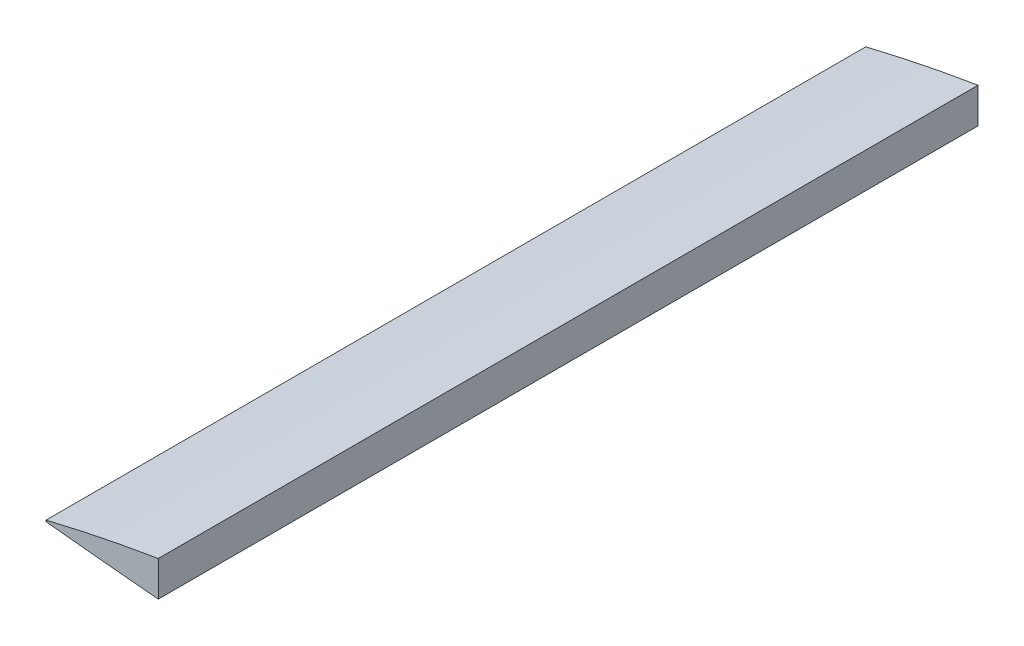
ISO-10303-21;
HEADER;
FILE_DESCRIPTION(('STEP AP214'),'2;1');
FILE_NAME('part.step','',(''),(''),'','','');
FILE_SCHEMA(('AUTOMOTIVE_DESIGN { 1 0 10303 214 1 1 1 1 }'));
ENDSEC;
DATA;
#1=APPLICATION_CONTEXT('core data for automotive mechanical design processes');
#2=APPLICATION_PROTOCOL_DEFINITION('international standard','automotive_design',2000,#1);
#3=PRODUCT_CONTEXT('',#1,'mechanical');
#4=PRODUCT('Part','Part','',(#3));
#5=PRODUCT_RELATED_PRODUCT_CATEGORY('part','',(#4));
#6=PRODUCT_DEFINITION_FORMATION('','',#4);
#7=PRODUCT_DEFINITION_CONTEXT('part definition',#1,'design');
#8=PRODUCT_DEFINITION('design','',#6,#7);
#9=PRODUCT_DEFINITION_SHAPE('','',#8);
#10=(LENGTH_UNIT() NAMED_UNIT(*) SI_UNIT(.MILLI.,.METRE.));
#11=(NAMED_UNIT(*) PLANE_ANGLE_UNIT() SI_UNIT($,.RADIAN.));
#12=(NAMED_UNIT(*) SI_UNIT($,.STERADIAN.) SOLID_ANGLE_UNIT());
#13=UNCERTAINTY_MEASURE_WITH_UNIT(LENGTH_MEASURE(1.E-05),#10,'distance_accuracy_value','');
#14=(GEOMETRIC_REPRESENTATION_CONTEXT(3) GLOBAL_UNCERTAINTY_ASSIGNED_CONTEXT((#13)) GLOBAL_UNIT_ASSIGNED_CONTEXT((#10,
#11,#12)) REPRESENTATION_CONTEXT('',''));
#15=CARTESIAN_POINT('',(0.,0.,0.));
#16=DIRECTION('',(0.,0.,1.));
#17=DIRECTION('',(1.,0.,0.));
#18=AXIS2_PLACEMENT_3D('',#15,#16,#17);
#19=CARTESIAN_POINT('',(-238.52642,17.5878370076643,-612.));
#20=CARTESIAN_POINT('',(-240.974092949972,17.1818838754023,-612.));
#21=CARTESIAN_POINT('',(-246.929768523728,16.1941190868382,-612.));
#22=CARTESIAN_POINT('',(-256.181161895511,14.5460715684089,-612.));
#23=CARTESIAN_POINT('',(-266.070660074322,12.7092596735176,-612.));
#24=CARTESIAN_POINT('',(-275.306483122763,10.9116484889903,-612.));
#25=CARTESIAN_POINT('',(-283.834265101251,9.183942036888,-612.));
#26=CARTESIAN_POINT('',(-291.603292922688,7.5511249847941,-612.));
#27=CARTESIAN_POINT('',(-298.567864300226,6.03877561329265,-612.));
#28=CARTESIAN_POINT('',(-304.687234381282,4.67105765373805,-612.));
#29=CARTESIAN_POINT('',(-309.925850126722,3.47060146510907,-612.));
#30=CARTESIAN_POINT('',(-314.253461717538,2.45784481186031,-612.));
#31=CARTESIAN_POINT('',(-317.645235976134,1.65054432161122,-612.));
#32=CARTESIAN_POINT('',(-320.081782459232,1.06307048748221,-612.));
#33=CARTESIAN_POINT('',(-321.538022535749,0.70902490136111,-612.));
#34=CARTESIAN_POINT('',(-322.180548985879,0.552044035812624,-612.));
#35=CARTESIAN_POINT('',(-322.333,0.514797487992484,-612.));
#36=B_SPLINE_CURVE_WITH_KNOTS('',3,(#19,#20,#21,#22,#23,#24,#25,#26,#27,#28,#29,#30,#31,#32,#33,
#34,#35),.UNSPECIFIED.,.F.,.F.,(4,1,1,1,1,1,1,1,1,1,1,1,1,1,4),(0.,0.0870070051452904,
0.21170536500617,0.329527112719374,0.439740644540536,0.541660709078569,0.634652346186561,
0.718134668905484,0.791584505134145,0.854539888493236,0.906603358473801,0.947445002011979,
0.976805146454737,0.994496601743555,1.),.UNSPECIFIED.);
#37=DIRECTION('',(0.,0.,1.));
#38=VECTOR('',#37,1.);
#39=SURFACE_OF_LINEAR_EXTRUSION('',#36,#38);
#40=CARTESIAN_POINT('',(-238.52642,17.5878370076643,0.));
#41=CARTESIAN_POINT('',(-240.974092949972,17.1818838754023,0.));
#42=CARTESIAN_POINT('',(-246.929768523728,16.1941190868382,0.));
#43=CARTESIAN_POINT('',(-256.181161895511,14.5460715684089,0.));
#44=CARTESIAN_POINT('',(-266.070660074322,12.7092596735176,0.));
#45=CARTESIAN_POINT('',(-275.306483122763,10.9116484889903,0.));
#46=CARTESIAN_POINT('',(-283.834265101251,9.183942036888,0.));
#47=CARTESIAN_POINT('',(-291.603292922688,7.5511249847941,0.));
#48=CARTESIAN_POINT('',(-298.567864300226,6.03877561329265,0.));
#49=CARTESIAN_POINT('',(-304.687234381282,4.67105765373805,0.));
#50=CARTESIAN_POINT('',(-309.925850126722,3.47060146510907,0.));
#51=CARTESIAN_POINT('',(-314.253461717538,2.45784481186031,0.));
#52=CARTESIAN_POINT('',(-317.645235976134,1.65054432161122,0.));
#53=CARTESIAN_POINT('',(-320.081782459232,1.06307048748221,0.));
#54=CARTESIAN_POINT('',(-321.538022535749,0.70902490136111,0.));
#55=CARTESIAN_POINT('',(-322.180548985879,0.552044035812624,0.));
#56=CARTESIAN_POINT('',(-322.333,0.514797487992484,0.));
#57=B_SPLINE_CURVE_WITH_KNOTS('',3,(#40,#41,#42,#43,#44,#45,#46,#47,#48,#49,#50,#51,#52,#53,#54,
#55,#56),.UNSPECIFIED.,.F.,.F.,(4,1,1,1,1,1,1,1,1,1,1,1,1,1,4),(0.,0.0870070051452904,
0.21170536500617,0.329527112719374,0.439740644540536,0.541660709078569,0.634652346186561,
0.718134668905484,0.791584505134145,0.854539888493236,0.906603358473801,0.947445002011979,
0.976805146454737,0.994496601743555,1.),.UNSPECIFIED.);
#58=CARTESIAN_POINT('',(-238.52642,17.5878370076643,0.));
#59=VERTEX_POINT('',#58);
#60=CARTESIAN_POINT('',(-322.333,0.514797487992484,0.));
#61=VERTEX_POINT('',#60);
#62=EDGE_CURVE('E133',#59,#61,#57,.T.);
#63=ORIENTED_EDGE('',*,*,#62,.F.);
#64=DIRECTION('',(0.,0.,1.));
#65=VECTOR('',#64,1.);
#66=CARTESIAN_POINT('',(-238.52642,17.5878370076643,-612.));
#67=LINE('',#66,#65);
#68=CARTESIAN_POINT('',(-238.52642,17.5878370076643,-612.));
#69=VERTEX_POINT('',#68);
#70=EDGE_CURVE('E65',#69,#59,#67,.T.);
#71=ORIENTED_EDGE('',*,*,#70,.F.);
#72=CARTESIAN_POINT('',(-322.333,0.514797487992484,-612.));
#73=VERTEX_POINT('',#72);
#74=EDGE_CURVE('E146',#69,#73,#36,.T.);
#75=ORIENTED_EDGE('',*,*,#74,.T.);
#76=DIRECTION('',(0.,0.,1.));
#77=VECTOR('',#76,1.);
#78=CARTESIAN_POINT('',(-322.333,0.514797487992484,-612.));
#79=LINE('',#78,#77);
#80=EDGE_CURVE('E91',#73,#61,#79,.T.);
#81=ORIENTED_EDGE('',*,*,#80,.T.);
#82=EDGE_LOOP('',(#63,#71,#75,#81));
#83=FACE_BOUND('',#82,.T.);
#84=ADVANCED_FACE('F39',(#83),#39,.T.);
#85=CARTESIAN_POINT('',(-238.52642,17.5878370076643,-612.));
#86=DIRECTION('',(1.,0.,0.));
#87=DIRECTION('',(0.,0.,-1.));
#88=AXIS2_PLACEMENT_3D('',#85,#86,#87);
#89=PLANE('',#88);
#90=DIRECTION('',(0.,1.,0.));
#91=VECTOR('',#90,1.);
#92=CARTESIAN_POINT('',(-238.52642,17.5878370076643,0.));
#93=LINE('',#92,#91);
#94=CARTESIAN_POINT('',(-238.52642,-8.71669260823671,0.));
#95=VERTEX_POINT('',#94);
#96=EDGE_CURVE('E152',#95,#59,#93,.T.);
#97=ORIENTED_EDGE('',*,*,#96,.F.);
#98=DIRECTION('',(0.,0.,1.));
#99=VECTOR('',#98,1.);
#100=CARTESIAN_POINT('',(-238.52642,-8.71669260823671,-612.));
#101=LINE('',#100,#99);
#102=CARTESIAN_POINT('',(-238.52642,-8.71669260823671,-612.));
#103=VERTEX_POINT('',#102);
#104=EDGE_CURVE('E204',#103,#95,#101,.T.);
#105=ORIENTED_EDGE('',*,*,#104,.F.);
#106=DIRECTION('',(0.,1.,0.));
#107=VECTOR('',#106,1.);
#108=CARTESIAN_POINT('',(-238.52642,17.5878370076643,-612.));
#109=LINE('',#108,#107);
#110=EDGE_CURVE('E163',#103,#69,#109,.T.);
#111=ORIENTED_EDGE('',*,*,#110,.T.);
#112=ORIENTED_EDGE('',*,*,#70,.T.);
#113=EDGE_LOOP('',(#97,#105,#111,#112));
#114=FACE_BOUND('',#113,.T.);
#115=ADVANCED_FACE('F173',(#114),#89,.T.);
#116=CARTESIAN_POINT('',(-322.333,-0.506550056177637,-612.));
#117=CARTESIAN_POINT('',(-322.321741192867,-0.506509981551179,-612.));
#118=CARTESIAN_POINT('',(-322.141989510192,-0.505870172959284,-612.));
#119=CARTESIAN_POINT('',(-321.464120443008,-0.620061141040111,-612.));
#120=CARTESIAN_POINT('',(-319.961203892299,-0.741044399369998,-612.));
#121=CARTESIAN_POINT('',(-317.472079994317,-1.02767765853985,-612.));
#122=CARTESIAN_POINT('',(-314.008232693801,-1.38276070488723,-612.));
#123=CARTESIAN_POINT('',(-309.594932863968,-1.84681463713867,-612.));
#124=CARTESIAN_POINT('',(-304.260184655827,-2.39533472644298,-612.));
#125=CARTESIAN_POINT('',(-298.039247242634,-3.02859766428665,-612.));
#126=CARTESIAN_POINT('',(-290.972478701488,-3.73716679662763,-612.));
#127=CARTESIAN_POINT('',(-283.105667880865,-4.514534116657,-612.));
#128=CARTESIAN_POINT('',(-274.489440351608,-5.35291829584387,-612.));
#129=CARTESIAN_POINT('',(-265.178981161559,-6.24499515598002,-612.));
#130=CARTESIAN_POINT('',(-255.233473927844,-7.18185891999825,-612.));
#131=CARTESIAN_POINT('',(-246.278870053507,-8.01388768890295,-612.));
#132=CARTESIAN_POINT('',(-240.645712688873,-8.52456633628809,-612.));
#133=CARTESIAN_POINT('',(-238.52642,-8.71669260823671,-612.));
#134=B_SPLINE_CURVE_WITH_KNOTS('',3,(#116,#117,#118,#119,#120,#121,#122,#123,#124,#125,#126,
#127,#128,#129,#130,#131,#132,#133),.UNSPECIFIED.,.F.,.F.,(4,1,1,1,1,1,1,1,1,1,1,1,1,1,1,4),(0.,
0.000401027004237386,0.00640256804801387,0.024366740541906,0.0541726551316404,
0.0956203448841404,0.148432949269866,0.212259606924723,0.286678920603446,0.371202853061501,
0.465280924763119,0.568304609739685,0.67961185947699,0.798491720853711,0.924189047970984,1.),.UNSPECIFIED.);
#135=DIRECTION('',(0.,0.,1.));
#136=VECTOR('',#135,1.);
#137=SURFACE_OF_LINEAR_EXTRUSION('',#134,#136);
#138=CARTESIAN_POINT('',(-322.333,-0.506550056177637,-83.8999999999999));
#139=CARTESIAN_POINT('',(-322.321741192867,-0.506509981551179,-83.8999999999999));
#140=CARTESIAN_POINT('',(-322.141989510192,-0.505870172959284,-83.8999999999999));
#141=CARTESIAN_POINT('',(-321.464120443008,-0.620061141040111,-83.8999999999999));
#142=CARTESIAN_POINT('',(-319.961203892299,-0.741044399369998,-83.8999999999999));
#143=CARTESIAN_POINT('',(-317.472079994317,-1.02767765853985,-83.8999999999999));
#144=CARTESIAN_POINT('',(-314.008232693801,-1.38276070488723,-83.8999999999999));
#145=CARTESIAN_POINT('',(-309.594932863968,-1.84681463713867,-83.8999999999999));
#146=CARTESIAN_POINT('',(-304.260184655827,-2.39533472644298,-83.8999999999999));
#147=CARTESIAN_POINT('',(-298.039247242634,-3.02859766428665,-83.8999999999999));
#148=CARTESIAN_POINT('',(-290.972478701488,-3.73716679662763,-83.8999999999999));
#149=CARTESIAN_POINT('',(-283.105667880865,-4.514534116657,-83.8999999999999));
#150=CARTESIAN_POINT('',(-274.489440351608,-5.35291829584387,-83.8999999999999));
#151=CARTESIAN_POINT('',(-265.178981161559,-6.24499515598002,-83.8999999999999));
#152=CARTESIAN_POINT('',(-255.233473927844,-7.18185891999825,-83.8999999999999));
#153=CARTESIAN_POINT('',(-246.278870053507,-8.01388768890295,-83.8999999999999));
#154=CARTESIAN_POINT('',(-240.645712688873,-8.52456633628809,-83.8999999999999));
#155=CARTESIAN_POINT('',(-238.52642,-8.71669260823671,-83.8999999999999));
#156=B_SPLINE_CURVE_WITH_KNOTS('',3,(#138,#139,#140,#141,#142,#143,#144,#145,#146,#147,#148,
#149,#150,#151,#152,#153,#154,#155),.UNSPECIFIED.,.F.,.F.,(4,1,1,1,1,1,1,1,1,1,1,1,1,1,1,4),(0.,
0.000401027004237386,0.00640256804801387,0.024366740541906,0.0541726551316404,
0.0956203448841404,0.148432949269866,0.212259606924723,0.286678920603446,0.371202853061501,
0.465280924763119,0.568304609739685,0.67961185947699,0.798491720853711,0.924189047970984,1.),.UNSPECIFIED.);
#157=CARTESIAN_POINT('',(-241.25,-8.46964250475909,-83.8999999999999));
#158=VERTEX_POINT('',#157);
#159=CARTESIAN_POINT('',(-262.25,-6.51994947132136,-83.8999999999999));
#160=VERTEX_POINT('',#159);
#161=EDGE_CURVE('E11',#158,#160,#156,.F.);
#162=ORIENTED_EDGE('',*,*,#161,.F.);
#163=DIRECTION('',(0.,0.,1.));
#164=VECTOR('',#163,1.);
#165=CARTESIAN_POINT('',(-241.25,-8.46964250475909,-612.));
#166=LINE('',#165,#164);
#167=CARTESIAN_POINT('',(-241.25,-8.46964250475909,-96.8999999999999));
#168=VERTEX_POINT('',#167);
#169=EDGE_CURVE('E121',#158,#168,#166,.F.);
#170=ORIENTED_EDGE('',*,*,#169,.T.);
#171=CARTESIAN_POINT('',(-322.333,-0.506550056177637,-96.9));
#172=CARTESIAN_POINT('',(-322.321741192867,-0.506509981551179,-96.9));
#173=CARTESIAN_POINT('',(-322.141989510192,-0.505870172959284,-96.9));
#174=CARTESIAN_POINT('',(-321.464120443008,-0.620061141040111,-96.9));
#175=CARTESIAN_POINT('',(-319.961203892299,-0.741044399369998,-96.9));
#176=CARTESIAN_POINT('',(-317.472079994317,-1.02767765853985,-96.9));
#177=CARTESIAN_POINT('',(-314.008232693801,-1.38276070488723,-96.9));
#178=CARTESIAN_POINT('',(-309.594932863968,-1.84681463713867,-96.9));
#179=CARTESIAN_POINT('',(-304.260184655827,-2.39533472644298,-96.9));
#180=CARTESIAN_POINT('',(-298.039247242634,-3.02859766428665,-96.9));
#181=CARTESIAN_POINT('',(-290.972478701488,-3.73716679662763,-96.9));
#182=CARTESIAN_POINT('',(-283.105667880865,-4.514534116657,-96.9));
#183=CARTESIAN_POINT('',(-274.489440351608,-5.35291829584387,-96.9));
#184=CARTESIAN_POINT('',(-265.178981161559,-6.24499515598002,-96.9));
#185=CARTESIAN_POINT('',(-255.233473927844,-7.18185891999825,-96.9));
#186=CARTESIAN_POINT('',(-246.278870053507,-8.01388768890295,-96.9));
#187=CARTESIAN_POINT('',(-240.645712688873,-8.52456633628809,-96.9));
#188=CARTESIAN_POINT('',(-238.52642,-8.71669260823671,-96.9));
#189=B_SPLINE_CURVE_WITH_KNOTS('',3,(#171,#172,#173,#174,#175,#176,#177,#178,#179,#180,#181,
#182,#183,#184,#185,#186,#187,#188),.UNSPECIFIED.,.F.,.F.,(4,1,1,1,1,1,1,1,1,1,1,1,1,1,1,4),(0.,
0.000401027004237386,0.00640256804801387,0.024366740541906,0.0541726551316404,
0.0956203448841404,0.148432949269866,0.212259606924723,0.286678920603446,0.371202853061501,
0.465280924763119,0.568304609739685,0.67961185947699,0.798491720853711,0.924189047970984,1.),.UNSPECIFIED.);
#190=CARTESIAN_POINT('',(-262.249999991514,-6.51994947132136,-96.9));
#191=VERTEX_POINT('',#190);
#192=EDGE_CURVE('E203',#168,#191,#189,.F.);
#193=ORIENTED_EDGE('',*,*,#192,.T.);
#194=DIRECTION('',(0.,0.,1.));
#195=VECTOR('',#194,1.);
#196=CARTESIAN_POINT('',(-262.25,-6.51994947051922,-612.));
#197=LINE('',#196,#195);
#198=EDGE_CURVE('E49',#191,#160,#197,.T.);
#199=ORIENTED_EDGE('',*,*,#198,.T.);
#200=EDGE_LOOP('',(#162,#170,#193,#199));
#201=FACE_BOUND('',#200,.T.);
#202=CARTESIAN_POINT('',(-322.333,-0.506550056177637,0.));
#203=CARTESIAN_POINT('',(-322.321741192867,-0.506509981551179,0.));
#204=CARTESIAN_POINT('',(-322.141989510192,-0.505870172959284,0.));
#205=CARTESIAN_POINT('',(-321.464120443008,-0.620061141040111,0.));
#206=CARTESIAN_POINT('',(-319.961203892299,-0.741044399369998,0.));
#207=CARTESIAN_POINT('',(-317.472079994317,-1.02767765853985,0.));
#208=CARTESIAN_POINT('',(-314.008232693801,-1.38276070488723,0.));
#209=CARTESIAN_POINT('',(-309.594932863968,-1.84681463713867,0.));
#210=CARTESIAN_POINT('',(-304.260184655827,-2.39533472644298,0.));
#211=CARTESIAN_POINT('',(-298.039247242634,-3.02859766428665,0.));
#212=CARTESIAN_POINT('',(-290.972478701488,-3.73716679662763,0.));
#213=CARTESIAN_POINT('',(-283.105667880865,-4.514534116657,0.));
#214=CARTESIAN_POINT('',(-274.489440351608,-5.35291829584387,0.));
#215=CARTESIAN_POINT('',(-265.178981161559,-6.24499515598002,0.));
#216=CARTESIAN_POINT('',(-255.233473927844,-7.18185891999825,0.));
#217=CARTESIAN_POINT('',(-246.278870053507,-8.01388768890295,0.));
#218=CARTESIAN_POINT('',(-240.645712688873,-8.52456633628809,0.));
#219=CARTESIAN_POINT('',(-238.52642,-8.71669260823671,0.));
#220=B_SPLINE_CURVE_WITH_KNOTS('',3,(#202,#203,#204,#205,#206,#207,#208,#209,#210,#211,#212,
#213,#214,#215,#216,#217,#218,#219),.UNSPECIFIED.,.F.,.F.,(4,1,1,1,1,1,1,1,1,1,1,1,1,1,1,4),(0.,
0.000401027004237386,0.00640256804801387,0.024366740541906,0.0541726551316404,
0.0956203448841404,0.148432949269866,0.212259606924723,0.286678920603446,0.371202853061501,
0.465280924763119,0.568304609739685,0.67961185947699,0.798491720853711,0.924189047970984,1.),.UNSPECIFIED.);
#221=CARTESIAN_POINT('',(-322.333,-0.506550056177637,0.));
#222=VERTEX_POINT('',#221);
#223=EDGE_CURVE('E195',#222,#95,#220,.T.);
#224=ORIENTED_EDGE('',*,*,#223,.F.);
#225=DIRECTION('',(0.,0.,1.));
#226=VECTOR('',#225,1.);
#227=CARTESIAN_POINT('',(-322.333,-0.506550056177637,-612.));
#228=LINE('',#227,#226);
#229=CARTESIAN_POINT('',(-322.333,-0.506550056177637,-612.));
#230=VERTEX_POINT('',#229);
#231=EDGE_CURVE('E206',#230,#222,#228,.T.);
#232=ORIENTED_EDGE('',*,*,#231,.F.);
#233=EDGE_CURVE('E157',#230,#103,#134,.T.);
#234=ORIENTED_EDGE('',*,*,#233,.T.);
#235=ORIENTED_EDGE('',*,*,#104,.T.);
#236=EDGE_LOOP('',(#224,#232,#234,#235));
#237=FACE_BOUND('',#236,.T.);
#238=ADVANCED_FACE('F169',(#201,#237),#137,.T.);
#239=CARTESIAN_POINT('',(-322.333,0.514797487992484,-612.));
#240=DIRECTION('',(-1.,0.,0.));
#241=DIRECTION('',(0.,0.,1.));
#242=AXIS2_PLACEMENT_3D('',#239,#240,#241);
#243=PLANE('',#242);
#244=DIRECTION('',(0.,-1.,0.));
#245=VECTOR('',#244,1.);
#246=CARTESIAN_POINT('',(-322.333,0.514797487992484,0.));
#247=LINE('',#246,#245);
#248=EDGE_CURVE('E192',#61,#222,#247,.T.);
#249=ORIENTED_EDGE('',*,*,#248,.F.);
#250=ORIENTED_EDGE('',*,*,#80,.F.);
#251=DIRECTION('',(0.,-1.,0.));
#252=VECTOR('',#251,1.);
#253=CARTESIAN_POINT('',(-322.333,0.514797487992484,-612.));
#254=LINE('',#253,#252);
#255=EDGE_CURVE('E151',#73,#230,#254,.T.);
#256=ORIENTED_EDGE('',*,*,#255,.T.);
#257=ORIENTED_EDGE('',*,*,#231,.T.);
#258=EDGE_LOOP('',(#249,#250,#256,#257));
#259=FACE_BOUND('',#258,.T.);
#260=ADVANCED_FACE('F172',(#259),#243,.T.);
#261=CARTESIAN_POINT('',(-280.590138371107,9.83812054521177,-612.));
#262=DIRECTION('',(0.,0.,-1.));
#263=DIRECTION('',(-1.,0.,0.));
#264=AXIS2_PLACEMENT_3D('',#261,#262,#263);
#265=PLANE('',#264);
#266=ORIENTED_EDGE('',*,*,#74,.F.);
#267=ORIENTED_EDGE('',*,*,#110,.F.);
#268=ORIENTED_EDGE('',*,*,#233,.F.);
#269=ORIENTED_EDGE('',*,*,#255,.F.);
#270=EDGE_LOOP('',(#266,#267,#268,#269));
#271=FACE_BOUND('',#270,.T.);
#272=ADVANCED_FACE('F177',(#271),#265,.T.);
#273=CARTESIAN_POINT('',(-280.590138371107,9.83812054521177,0.));
#274=DIRECTION('',(0.,0.,-1.));
#275=DIRECTION('',(-1.,0.,0.));
#276=AXIS2_PLACEMENT_3D('',#273,#274,#275);
#277=PLANE('',#276);
#278=ORIENTED_EDGE('',*,*,#62,.T.);
#279=ORIENTED_EDGE('',*,*,#248,.T.);
#280=ORIENTED_EDGE('',*,*,#223,.T.);
#281=ORIENTED_EDGE('',*,*,#96,.T.);
#282=EDGE_LOOP('',(#278,#279,#280,#281));
#283=FACE_BOUND('',#282,.T.);
#284=ADVANCED_FACE('F182',(#283),#277,.F.);
#285=CARTESIAN_POINT('',(-262.25,2.41,-83.8999999999999));
#286=DIRECTION('',(1.,0.,0.));
#287=DIRECTION('',(0.,0.,-1.));
#288=AXIS2_PLACEMENT_3D('',#285,#286,#287);
#289=PLANE('',#288);
#290=DIRECTION('',(0.,-1.,0.));
#291=VECTOR('',#290,1.);
#292=CARTESIAN_POINT('',(-262.25,2.41,-96.8999999999999));
#293=LINE('',#292,#291);
#294=CARTESIAN_POINT('',(-262.25,2.41,-96.8999999999999));
#295=VERTEX_POINT('',#294);
#296=EDGE_CURVE('E56',#295,#191,#293,.T.);
#297=ORIENTED_EDGE('',*,*,#296,.F.);
#298=DIRECTION('',(0.,0.,-1.));
#299=VECTOR('',#298,1.);
#300=CARTESIAN_POINT('',(-262.25,2.41,-83.8999999999999));
#301=LINE('',#300,#299);
#302=CARTESIAN_POINT('',(-262.25,2.41,-83.8999999999999));
#303=VERTEX_POINT('',#302);
#304=EDGE_CURVE('E134',#303,#295,#301,.T.);
#305=ORIENTED_EDGE('',*,*,#304,.F.);
#306=DIRECTION('',(0.,-1.,0.));
#307=VECTOR('',#306,1.);
#308=CARTESIAN_POINT('',(-262.25,2.41,-83.8999999999999));
#309=LINE('',#308,#307);
#310=EDGE_CURVE('E126',#303,#160,#309,.T.);
#311=ORIENTED_EDGE('',*,*,#310,.T.);
#312=ORIENTED_EDGE('',*,*,#198,.F.);
#313=EDGE_LOOP('',(#297,#305,#311,#312));
#314=FACE_BOUND('',#313,.T.);
#315=ADVANCED_FACE('F219',(#314),#289,.T.);
#316=CARTESIAN_POINT('',(-241.25,-9.09,-83.8999999999999));
#317=DIRECTION('',(-1.,0.,0.));
#318=DIRECTION('',(0.,0.,1.));
#319=AXIS2_PLACEMENT_3D('',#316,#317,#318);
#320=PLANE('',#319);
#321=DIRECTION('',(0.,1.,0.));
#322=VECTOR('',#321,1.);
#323=CARTESIAN_POINT('',(-241.25,-9.09,-83.8999999999999));
#324=LINE('',#323,#322);
#325=CARTESIAN_POINT('',(-241.25,2.41,-83.8999999999999));
#326=VERTEX_POINT('',#325);
#327=EDGE_CURVE('E114',#158,#326,#324,.T.);
#328=ORIENTED_EDGE('',*,*,#327,.T.);
#329=DIRECTION('',(0.,0.,-1.));
#330=VECTOR('',#329,1.);
#331=CARTESIAN_POINT('',(-241.25,2.41,-83.8999999999999));
#332=LINE('',#331,#330);
#333=CARTESIAN_POINT('',(-241.25,2.41,-96.8999999999999));
#334=VERTEX_POINT('',#333);
#335=EDGE_CURVE('E118',#326,#334,#332,.T.);
#336=ORIENTED_EDGE('',*,*,#335,.T.);
#337=DIRECTION('',(0.,1.,0.));
#338=VECTOR('',#337,1.);
#339=CARTESIAN_POINT('',(-241.25,-9.09,-96.8999999999999));
#340=LINE('',#339,#338);
#341=EDGE_CURVE('E144',#168,#334,#340,.T.);
#342=ORIENTED_EDGE('',*,*,#341,.F.);
#343=ORIENTED_EDGE('',*,*,#169,.F.);
#344=EDGE_LOOP('',(#328,#336,#342,#343));
#345=FACE_BOUND('',#344,.T.);
#346=ADVANCED_FACE('F116',(#345),#320,.T.);
#347=CARTESIAN_POINT('',(-241.25,2.41,-83.8999999999999));
#348=DIRECTION('',(0.,-1.,0.));
#349=DIRECTION('',(0.,0.,-1.));
#350=AXIS2_PLACEMENT_3D('',#347,#348,#349);
#351=PLANE('',#350);
#352=DIRECTION('',(-1.,0.,0.));
#353=VECTOR('',#352,1.);
#354=CARTESIAN_POINT('',(-241.25,2.41,-96.8999999999999));
#355=LINE('',#354,#353);
#356=EDGE_CURVE('E132',#334,#295,#355,.T.);
#357=ORIENTED_EDGE('',*,*,#356,.F.);
#358=ORIENTED_EDGE('',*,*,#335,.F.);
#359=DIRECTION('',(-1.,0.,0.));
#360=VECTOR('',#359,1.);
#361=CARTESIAN_POINT('',(-241.25,2.41,-83.8999999999999));
#362=LINE('',#361,#360);
#363=EDGE_CURVE('E125',#326,#303,#362,.T.);
#364=ORIENTED_EDGE('',*,*,#363,.T.);
#365=ORIENTED_EDGE('',*,*,#304,.T.);
#366=EDGE_LOOP('',(#357,#358,#364,#365));
#367=FACE_BOUND('',#366,.T.);
#368=ADVANCED_FACE('F129',(#367),#351,.T.);
#369=CARTESIAN_POINT('',(0.,0.,-83.8999999999999));
#370=DIRECTION('',(0.,0.,1.));
#371=DIRECTION('',(1.,0.,0.));
#372=AXIS2_PLACEMENT_3D('',#369,#370,#371);
#373=PLANE('',#372);
#374=ORIENTED_EDGE('',*,*,#161,.T.);
#375=ORIENTED_EDGE('',*,*,#310,.F.);
#376=ORIENTED_EDGE('',*,*,#363,.F.);
#377=ORIENTED_EDGE('',*,*,#327,.F.);
#378=EDGE_LOOP('',(#374,#375,#376,#377));
#379=FACE_BOUND('',#378,.T.);
#380=ADVANCED_FACE('F137',(#379),#373,.F.);
#381=CARTESIAN_POINT('',(0.,0.,-96.8999999999999));
#382=DIRECTION('',(0.,0.,1.));
#383=DIRECTION('',(1.,0.,0.));
#384=AXIS2_PLACEMENT_3D('',#381,#382,#383);
#385=PLANE('',#384);
#386=ORIENTED_EDGE('',*,*,#341,.T.);
#387=ORIENTED_EDGE('',*,*,#356,.T.);
#388=ORIENTED_EDGE('',*,*,#296,.T.);
#389=ORIENTED_EDGE('',*,*,#192,.F.);
#390=EDGE_LOOP('',(#386,#387,#388,#389));
#391=FACE_BOUND('',#390,.T.);
#392=ADVANCED_FACE('F230',(#391),#385,.T.);
#393=CLOSED_SHELL('',(#84,#115,#238,#260,#272,#284,#315,#346,#368,#380,#392));
#394=MANIFOLD_SOLID_BREP('B2',#393);
#395=ADVANCED_BREP_SHAPE_REPRESENTATION('',(#18,#394),#14);
#396=SHAPE_DEFINITION_REPRESENTATION(#9,#395);
ENDSEC;
END-ISO-10303-21;
